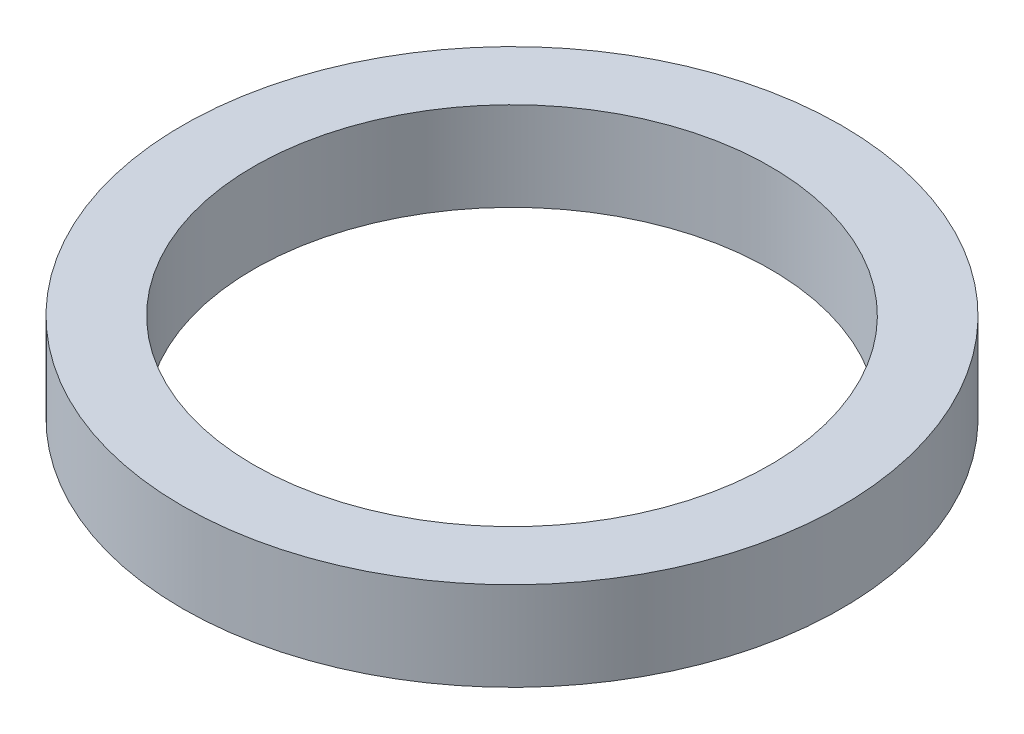
ISO-10303-21;
HEADER;
FILE_DESCRIPTION(('STEP AP214'),'2;1');
FILE_NAME('part.step','',(''),(''),'','','');
FILE_SCHEMA(('AUTOMOTIVE_DESIGN { 1 0 10303 214 1 1 1 1 }'));
ENDSEC;
DATA;
#1=APPLICATION_CONTEXT('core data for automotive mechanical design processes');
#2=APPLICATION_PROTOCOL_DEFINITION('international standard','automotive_design',2000,#1);
#3=PRODUCT_CONTEXT('',#1,'mechanical');
#4=PRODUCT('Part','Part','',(#3));
#5=PRODUCT_RELATED_PRODUCT_CATEGORY('part','',(#4));
#6=PRODUCT_DEFINITION_FORMATION('','',#4);
#7=PRODUCT_DEFINITION_CONTEXT('part definition',#1,'design');
#8=PRODUCT_DEFINITION('design','',#6,#7);
#9=PRODUCT_DEFINITION_SHAPE('','',#8);
#10=(LENGTH_UNIT() NAMED_UNIT(*) SI_UNIT(.MILLI.,.METRE.));
#11=(NAMED_UNIT(*) PLANE_ANGLE_UNIT() SI_UNIT($,.RADIAN.));
#12=(NAMED_UNIT(*) SI_UNIT($,.STERADIAN.) SOLID_ANGLE_UNIT());
#13=UNCERTAINTY_MEASURE_WITH_UNIT(LENGTH_MEASURE(1.E-05),#10,'distance_accuracy_value','');
#14=(GEOMETRIC_REPRESENTATION_CONTEXT(3) GLOBAL_UNCERTAINTY_ASSIGNED_CONTEXT((#13)) GLOBAL_UNIT_ASSIGNED_CONTEXT((#10,
#11,#12)) REPRESENTATION_CONTEXT('',''));
#15=CARTESIAN_POINT('',(0.,0.,0.));
#16=DIRECTION('',(0.,0.,1.));
#17=DIRECTION('',(1.,0.,0.));
#18=AXIS2_PLACEMENT_3D('',#15,#16,#17);
#19=CARTESIAN_POINT('',(0.,5.9,0.));
#20=DIRECTION('',(0.,1.,0.));
#21=DIRECTION('',(0.,0.,1.));
#22=AXIS2_PLACEMENT_3D('',#19,#20,#21);
#23=PLANE('',#22);
#24=CARTESIAN_POINT('',(0.,5.9,0.));
#25=DIRECTION('',(0.,1.,0.));
#26=DIRECTION('',(0.,0.,1.));
#27=AXIS2_PLACEMENT_3D('',#24,#25,#26);
#28=CIRCLE('',#27,21.875);
#29=CARTESIAN_POINT('',(0.,5.9,21.875));
#30=VERTEX_POINT('',#29);
#31=EDGE_CURVE('E10',#30,#30,#28,.T.);
#32=ORIENTED_EDGE('',*,*,#31,.T.);
#33=EDGE_LOOP('',(#32));
#34=FACE_BOUND('',#33,.T.);
#35=CARTESIAN_POINT('',(0.,5.9,0.));
#36=DIRECTION('',(0.,1.,0.));
#37=DIRECTION('',(0.,0.,1.));
#38=AXIS2_PLACEMENT_3D('',#35,#36,#37);
#39=CIRCLE('',#38,17.15);
#40=CARTESIAN_POINT('',(0.,5.9,17.15));
#41=VERTEX_POINT('',#40);
#42=EDGE_CURVE('E54',#41,#41,#39,.T.);
#43=ORIENTED_EDGE('',*,*,#42,.F.);
#44=EDGE_LOOP('',(#43));
#45=FACE_BOUND('',#44,.T.);
#46=ADVANCED_FACE('F41',(#34,#45),#23,.T.);
#47=CARTESIAN_POINT('',(0.,0.,0.));
#48=DIRECTION('',(0.,1.,0.));
#49=DIRECTION('',(0.,0.,1.));
#50=AXIS2_PLACEMENT_3D('',#47,#48,#49);
#51=PLANE('',#50);
#52=CARTESIAN_POINT('',(0.,0.,0.));
#53=DIRECTION('',(0.,1.,0.));
#54=DIRECTION('',(0.,0.,1.));
#55=AXIS2_PLACEMENT_3D('',#52,#53,#54);
#56=CIRCLE('',#55,21.875);
#57=CARTESIAN_POINT('',(0.,0.,21.875));
#58=VERTEX_POINT('',#57);
#59=EDGE_CURVE('E45',#58,#58,#56,.T.);
#60=ORIENTED_EDGE('',*,*,#59,.F.);
#61=EDGE_LOOP('',(#60));
#62=FACE_BOUND('',#61,.T.);
#63=CARTESIAN_POINT('',(0.,0.,0.));
#64=DIRECTION('',(0.,1.,0.));
#65=DIRECTION('',(0.,0.,1.));
#66=AXIS2_PLACEMENT_3D('',#63,#64,#65);
#67=CIRCLE('',#66,17.15);
#68=CARTESIAN_POINT('',(0.,0.,17.15));
#69=VERTEX_POINT('',#68);
#70=EDGE_CURVE('E56',#69,#69,#67,.T.);
#71=ORIENTED_EDGE('',*,*,#70,.T.);
#72=EDGE_LOOP('',(#71));
#73=FACE_BOUND('',#72,.T.);
#74=ADVANCED_FACE('F68',(#62,#73),#51,.F.);
#75=CARTESIAN_POINT('',(0.,5.9,0.));
#76=DIRECTION('',(0.,-1.,0.));
#77=DIRECTION('',(0.,0.,-1.));
#78=AXIS2_PLACEMENT_3D('',#75,#76,#77);
#79=CYLINDRICAL_SURFACE('',#78,21.875);
#80=ORIENTED_EDGE('',*,*,#31,.F.);
#81=EDGE_LOOP('',(#80));
#82=FACE_BOUND('',#81,.T.);
#83=ORIENTED_EDGE('',*,*,#59,.T.);
#84=EDGE_LOOP('',(#83));
#85=FACE_BOUND('',#84,.T.);
#86=ADVANCED_FACE('F43',(#82,#85),#79,.T.);
#87=CARTESIAN_POINT('',(0.,5.9,0.));
#88=DIRECTION('',(0.,-1.,0.));
#89=DIRECTION('',(0.,0.,-1.));
#90=AXIS2_PLACEMENT_3D('',#87,#88,#89);
#91=CYLINDRICAL_SURFACE('',#90,17.15);
#92=ORIENTED_EDGE('',*,*,#42,.T.);
#93=EDGE_LOOP('',(#92));
#94=FACE_BOUND('',#93,.T.);
#95=ORIENTED_EDGE('',*,*,#70,.F.);
#96=EDGE_LOOP('',(#95));
#97=FACE_BOUND('',#96,.T.);
#98=ADVANCED_FACE('F64',(#94,#97),#91,.F.);
#99=CLOSED_SHELL('',(#46,#74,#86,#98));
#100=MANIFOLD_SOLID_BREP('B2',#99);
#101=ADVANCED_BREP_SHAPE_REPRESENTATION('',(#18,#100),#14);
#102=SHAPE_DEFINITION_REPRESENTATION(#9,#101);
ENDSEC;
END-ISO-10303-21;
